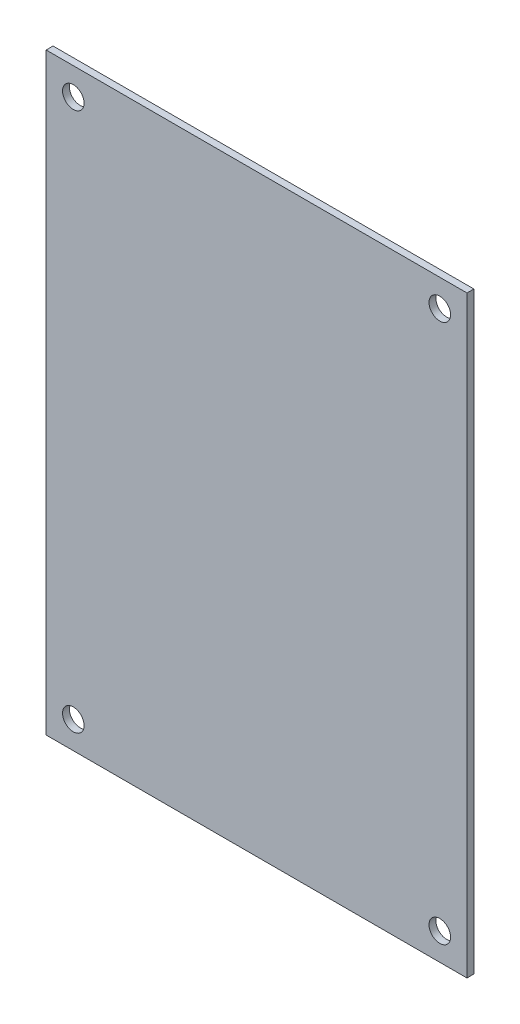
ISO-10303-21;
HEADER;
FILE_DESCRIPTION(('STEP AP214'),'2;1');
FILE_NAME('part.step','',(''),(''),'','','');
FILE_SCHEMA(('AUTOMOTIVE_DESIGN { 1 0 10303 214 1 1 1 1 }'));
ENDSEC;
DATA;
#1=APPLICATION_CONTEXT('core data for automotive mechanical design processes');
#2=APPLICATION_PROTOCOL_DEFINITION('international standard','automotive_design',2000,#1);
#3=PRODUCT_CONTEXT('',#1,'mechanical');
#4=PRODUCT('Part','Part','',(#3));
#5=PRODUCT_RELATED_PRODUCT_CATEGORY('part','',(#4));
#6=PRODUCT_DEFINITION_FORMATION('','',#4);
#7=PRODUCT_DEFINITION_CONTEXT('part definition',#1,'design');
#8=PRODUCT_DEFINITION('design','',#6,#7);
#9=PRODUCT_DEFINITION_SHAPE('','',#8);
#10=(LENGTH_UNIT() NAMED_UNIT(*) SI_UNIT(.MILLI.,.METRE.));
#11=(NAMED_UNIT(*) PLANE_ANGLE_UNIT() SI_UNIT($,.RADIAN.));
#12=(NAMED_UNIT(*) SI_UNIT($,.STERADIAN.) SOLID_ANGLE_UNIT());
#13=UNCERTAINTY_MEASURE_WITH_UNIT(LENGTH_MEASURE(1.E-05),#10,'distance_accuracy_value','');
#14=(GEOMETRIC_REPRESENTATION_CONTEXT(3) GLOBAL_UNCERTAINTY_ASSIGNED_CONTEXT((#13)) GLOBAL_UNIT_ASSIGNED_CONTEXT((#10,
#11,#12)) REPRESENTATION_CONTEXT('',''));
#15=CARTESIAN_POINT('',(0.,0.,0.));
#16=DIRECTION('',(0.,0.,1.));
#17=DIRECTION('',(1.,0.,0.));
#18=AXIS2_PLACEMENT_3D('',#15,#16,#17);
#19=CARTESIAN_POINT('',(61.976,-87.376,-1.016));
#20=DIRECTION('',(1.,0.,0.));
#21=DIRECTION('',(0.,0.,-1.));
#22=AXIS2_PLACEMENT_3D('',#19,#20,#21);
#23=PLANE('',#22);
#24=DIRECTION('',(0.,0.,1.));
#25=VECTOR('',#24,1.);
#26=CARTESIAN_POINT('',(61.976,87.376,-1.016));
#27=LINE('',#26,#25);
#28=CARTESIAN_POINT('',(61.976,87.376,-1.016));
#29=VERTEX_POINT('',#28);
#30=CARTESIAN_POINT('',(61.976,87.376,1.016));
#31=VERTEX_POINT('',#30);
#32=EDGE_CURVE('E44',#29,#31,#27,.T.);
#33=ORIENTED_EDGE('',*,*,#32,.T.);
#34=DIRECTION('',(0.,1.,0.));
#35=VECTOR('',#34,1.);
#36=CARTESIAN_POINT('',(61.976,-87.376,1.016));
#37=LINE('',#36,#35);
#38=CARTESIAN_POINT('',(61.976,-87.376,1.016));
#39=VERTEX_POINT('',#38);
#40=EDGE_CURVE('E82',#39,#31,#37,.T.);
#41=ORIENTED_EDGE('',*,*,#40,.F.);
#42=DIRECTION('',(0.,0.,1.));
#43=VECTOR('',#42,1.);
#44=CARTESIAN_POINT('',(61.976,-87.376,-1.016));
#45=LINE('',#44,#43);
#46=CARTESIAN_POINT('',(61.976,-87.376,-1.016));
#47=VERTEX_POINT('',#46);
#48=EDGE_CURVE('E11',#47,#39,#45,.T.);
#49=ORIENTED_EDGE('',*,*,#48,.F.);
#50=DIRECTION('',(0.,1.,0.));
#51=VECTOR('',#50,1.);
#52=CARTESIAN_POINT('',(61.976,-87.376,-1.016));
#53=LINE('',#52,#51);
#54=EDGE_CURVE('E83',#47,#29,#53,.T.);
#55=ORIENTED_EDGE('',*,*,#54,.T.);
#56=EDGE_LOOP('',(#33,#41,#49,#55));
#57=FACE_BOUND('',#56,.T.);
#58=ADVANCED_FACE('F41',(#57),#23,.T.);
#59=CARTESIAN_POINT('',(-61.976,-87.376,-1.016));
#60=DIRECTION('',(0.,-1.,0.));
#61=DIRECTION('',(0.,0.,-1.));
#62=AXIS2_PLACEMENT_3D('',#59,#60,#61);
#63=PLANE('',#62);
#64=ORIENTED_EDGE('',*,*,#48,.T.);
#65=DIRECTION('',(1.,0.,0.));
#66=VECTOR('',#65,1.);
#67=CARTESIAN_POINT('',(-61.976,-87.376,1.016));
#68=LINE('',#67,#66);
#69=CARTESIAN_POINT('',(-61.976,-87.376,1.016));
#70=VERTEX_POINT('',#69);
#71=EDGE_CURVE('E102',#70,#39,#68,.T.);
#72=ORIENTED_EDGE('',*,*,#71,.F.);
#73=DIRECTION('',(0.,0.,1.));
#74=VECTOR('',#73,1.);
#75=CARTESIAN_POINT('',(-61.976,-87.376,-1.016));
#76=LINE('',#75,#74);
#77=CARTESIAN_POINT('',(-61.976,-87.376,-1.016));
#78=VERTEX_POINT('',#77);
#79=EDGE_CURVE('E50',#78,#70,#76,.T.);
#80=ORIENTED_EDGE('',*,*,#79,.F.);
#81=DIRECTION('',(1.,0.,0.));
#82=VECTOR('',#81,1.);
#83=CARTESIAN_POINT('',(-61.976,-87.376,-1.016));
#84=LINE('',#83,#82);
#85=EDGE_CURVE('E89',#78,#47,#84,.T.);
#86=ORIENTED_EDGE('',*,*,#85,.T.);
#87=EDGE_LOOP('',(#64,#72,#80,#86));
#88=FACE_BOUND('',#87,.T.);
#89=ADVANCED_FACE('F164',(#88),#63,.T.);
#90=CARTESIAN_POINT('',(-61.976,-87.376,-1.016));
#91=DIRECTION('',(-1.,0.,0.));
#92=DIRECTION('',(0.,0.,1.));
#93=AXIS2_PLACEMENT_3D('',#90,#91,#92);
#94=PLANE('',#93);
#95=ORIENTED_EDGE('',*,*,#79,.T.);
#96=DIRECTION('',(0.,-1.,0.));
#97=VECTOR('',#96,1.);
#98=CARTESIAN_POINT('',(-61.976,-87.376,1.016));
#99=LINE('',#98,#97);
#100=CARTESIAN_POINT('',(-61.976,87.376,1.016));
#101=VERTEX_POINT('',#100);
#102=EDGE_CURVE('E97',#101,#70,#99,.T.);
#103=ORIENTED_EDGE('',*,*,#102,.F.);
#104=DIRECTION('',(0.,0.,1.));
#105=VECTOR('',#104,1.);
#106=CARTESIAN_POINT('',(-61.976,87.376,-1.016));
#107=LINE('',#106,#105);
#108=CARTESIAN_POINT('',(-61.976,87.376,-1.016));
#109=VERTEX_POINT('',#108);
#110=EDGE_CURVE('E88',#109,#101,#107,.T.);
#111=ORIENTED_EDGE('',*,*,#110,.F.);
#112=DIRECTION('',(0.,-1.,0.));
#113=VECTOR('',#112,1.);
#114=CARTESIAN_POINT('',(-61.976,-87.376,-1.016));
#115=LINE('',#114,#113);
#116=EDGE_CURVE('E138',#109,#78,#115,.T.);
#117=ORIENTED_EDGE('',*,*,#116,.T.);
#118=EDGE_LOOP('',(#95,#103,#111,#117));
#119=FACE_BOUND('',#118,.T.);
#120=ADVANCED_FACE('F161',(#119),#94,.T.);
#121=CARTESIAN_POINT('',(-61.976,87.376,-1.016));
#122=DIRECTION('',(0.,1.,0.));
#123=DIRECTION('',(0.,0.,1.));
#124=AXIS2_PLACEMENT_3D('',#121,#122,#123);
#125=PLANE('',#124);
#126=ORIENTED_EDGE('',*,*,#110,.T.);
#127=DIRECTION('',(-1.,0.,0.));
#128=VECTOR('',#127,1.);
#129=CARTESIAN_POINT('',(-61.976,87.376,1.016));
#130=LINE('',#129,#128);
#131=EDGE_CURVE('E91',#31,#101,#130,.T.);
#132=ORIENTED_EDGE('',*,*,#131,.F.);
#133=ORIENTED_EDGE('',*,*,#32,.F.);
#134=DIRECTION('',(-1.,0.,0.));
#135=VECTOR('',#134,1.);
#136=CARTESIAN_POINT('',(-61.976,87.376,-1.016));
#137=LINE('',#136,#135);
#138=EDGE_CURVE('E135',#29,#109,#137,.T.);
#139=ORIENTED_EDGE('',*,*,#138,.T.);
#140=EDGE_LOOP('',(#126,#132,#133,#139));
#141=FACE_BOUND('',#140,.T.);
#142=ADVANCED_FACE('F92',(#141),#125,.T.);
#143=CARTESIAN_POINT('',(0.,0.,-1.016));
#144=DIRECTION('',(0.,0.,-1.));
#145=DIRECTION('',(-1.,0.,0.));
#146=AXIS2_PLACEMENT_3D('',#143,#144,#145);
#147=PLANE('',#146);
#148=CARTESIAN_POINT('',(-53.975,-79.375,-1.016));
#149=DIRECTION('',(0.,0.,1.));
#150=DIRECTION('',(1.,0.,0.));
#151=AXIS2_PLACEMENT_3D('',#148,#149,#150);
#152=CIRCLE('',#151,3.175);
#153=CARTESIAN_POINT('',(-50.8,-79.375,-1.016));
#154=VERTEX_POINT('',#153);
#155=EDGE_CURVE('E117',#154,#154,#152,.T.);
#156=ORIENTED_EDGE('',*,*,#155,.T.);
#157=EDGE_LOOP('',(#156));
#158=FACE_BOUND('',#157,.T.);
#159=CARTESIAN_POINT('',(53.975,-79.375,-1.016));
#160=DIRECTION('',(0.,0.,1.));
#161=DIRECTION('',(1.,0.,0.));
#162=AXIS2_PLACEMENT_3D('',#159,#160,#161);
#163=CIRCLE('',#162,3.175);
#164=CARTESIAN_POINT('',(57.15,-79.375,-1.016));
#165=VERTEX_POINT('',#164);
#166=EDGE_CURVE('E121',#165,#165,#163,.T.);
#167=ORIENTED_EDGE('',*,*,#166,.T.);
#168=EDGE_LOOP('',(#167));
#169=FACE_BOUND('',#168,.T.);
#170=CARTESIAN_POINT('',(53.975,79.375,-1.016));
#171=DIRECTION('',(0.,0.,1.));
#172=DIRECTION('',(1.,0.,0.));
#173=AXIS2_PLACEMENT_3D('',#170,#171,#172);
#174=CIRCLE('',#173,3.175);
#175=CARTESIAN_POINT('',(57.15,79.375,-1.016));
#176=VERTEX_POINT('',#175);
#177=EDGE_CURVE('E125',#176,#176,#174,.T.);
#178=ORIENTED_EDGE('',*,*,#177,.T.);
#179=EDGE_LOOP('',(#178));
#180=FACE_BOUND('',#179,.T.);
#181=CARTESIAN_POINT('',(-53.975,79.375,-1.016));
#182=DIRECTION('',(0.,0.,1.));
#183=DIRECTION('',(1.,0.,0.));
#184=AXIS2_PLACEMENT_3D('',#181,#182,#183);
#185=CIRCLE('',#184,3.175);
#186=CARTESIAN_POINT('',(-50.8,79.375,-1.016));
#187=VERTEX_POINT('',#186);
#188=EDGE_CURVE('E129',#187,#187,#185,.T.);
#189=ORIENTED_EDGE('',*,*,#188,.T.);
#190=EDGE_LOOP('',(#189));
#191=FACE_BOUND('',#190,.T.);
#192=ORIENTED_EDGE('',*,*,#54,.F.);
#193=ORIENTED_EDGE('',*,*,#85,.F.);
#194=ORIENTED_EDGE('',*,*,#116,.F.);
#195=ORIENTED_EDGE('',*,*,#138,.F.);
#196=EDGE_LOOP('',(#192,#193,#194,#195));
#197=FACE_BOUND('',#196,.T.);
#198=ADVANCED_FACE('F166',(#158,#169,#180,#191,#197),#147,.T.);
#199=CARTESIAN_POINT('',(-53.975,79.375,-1.016));
#200=DIRECTION('',(0.,0.,1.));
#201=DIRECTION('',(1.,0.,0.));
#202=AXIS2_PLACEMENT_3D('',#199,#200,#201);
#203=CYLINDRICAL_SURFACE('',#202,3.175);
#204=ORIENTED_EDGE('',*,*,#188,.F.);
#205=EDGE_LOOP('',(#204));
#206=FACE_BOUND('',#205,.T.);
#207=CARTESIAN_POINT('',(-53.975,79.375,1.016));
#208=DIRECTION('',(0.,0.,1.));
#209=DIRECTION('',(1.,0.,0.));
#210=AXIS2_PLACEMENT_3D('',#207,#208,#209);
#211=CIRCLE('',#210,3.175);
#212=CARTESIAN_POINT('',(-50.8,79.375,1.016));
#213=VERTEX_POINT('',#212);
#214=EDGE_CURVE('E104',#213,#213,#211,.T.);
#215=ORIENTED_EDGE('',*,*,#214,.T.);
#216=EDGE_LOOP('',(#215));
#217=FACE_BOUND('',#216,.T.);
#218=ADVANCED_FACE('F168',(#206,#217),#203,.F.);
#219=CARTESIAN_POINT('',(53.975,79.375,-1.016));
#220=DIRECTION('',(0.,0.,1.));
#221=DIRECTION('',(1.,0.,0.));
#222=AXIS2_PLACEMENT_3D('',#219,#220,#221);
#223=CYLINDRICAL_SURFACE('',#222,3.175);
#224=ORIENTED_EDGE('',*,*,#177,.F.);
#225=EDGE_LOOP('',(#224));
#226=FACE_BOUND('',#225,.T.);
#227=CARTESIAN_POINT('',(53.975,79.375,1.016));
#228=DIRECTION('',(0.,0.,1.));
#229=DIRECTION('',(1.,0.,0.));
#230=AXIS2_PLACEMENT_3D('',#227,#228,#229);
#231=CIRCLE('',#230,3.175);
#232=CARTESIAN_POINT('',(57.15,79.375,1.016));
#233=VERTEX_POINT('',#232);
#234=EDGE_CURVE('E109',#233,#233,#231,.T.);
#235=ORIENTED_EDGE('',*,*,#234,.T.);
#236=EDGE_LOOP('',(#235));
#237=FACE_BOUND('',#236,.T.);
#238=ADVANCED_FACE('F175',(#226,#237),#223,.F.);
#239=CARTESIAN_POINT('',(53.975,-79.375,-1.016));
#240=DIRECTION('',(0.,0.,1.));
#241=DIRECTION('',(1.,0.,0.));
#242=AXIS2_PLACEMENT_3D('',#239,#240,#241);
#243=CYLINDRICAL_SURFACE('',#242,3.175);
#244=ORIENTED_EDGE('',*,*,#166,.F.);
#245=EDGE_LOOP('',(#244));
#246=FACE_BOUND('',#245,.T.);
#247=CARTESIAN_POINT('',(53.975,-79.375,1.016));
#248=DIRECTION('',(0.,0.,1.));
#249=DIRECTION('',(1.,0.,0.));
#250=AXIS2_PLACEMENT_3D('',#247,#248,#249);
#251=CIRCLE('',#250,3.175);
#252=CARTESIAN_POINT('',(57.15,-79.375,1.016));
#253=VERTEX_POINT('',#252);
#254=EDGE_CURVE('E252',#253,#253,#251,.T.);
#255=ORIENTED_EDGE('',*,*,#254,.T.);
#256=EDGE_LOOP('',(#255));
#257=FACE_BOUND('',#256,.T.);
#258=ADVANCED_FACE('F213',(#246,#257),#243,.F.);
#259=CARTESIAN_POINT('',(-53.975,-79.375,-1.016));
#260=DIRECTION('',(0.,0.,1.));
#261=DIRECTION('',(1.,0.,0.));
#262=AXIS2_PLACEMENT_3D('',#259,#260,#261);
#263=CYLINDRICAL_SURFACE('',#262,3.175);
#264=ORIENTED_EDGE('',*,*,#155,.F.);
#265=EDGE_LOOP('',(#264));
#266=FACE_BOUND('',#265,.T.);
#267=CARTESIAN_POINT('',(-53.975,-79.375,1.016));
#268=DIRECTION('',(0.,0.,1.));
#269=DIRECTION('',(1.,0.,0.));
#270=AXIS2_PLACEMENT_3D('',#267,#268,#269);
#271=CIRCLE('',#270,3.175);
#272=CARTESIAN_POINT('',(-50.8,-79.375,1.016));
#273=VERTEX_POINT('',#272);
#274=EDGE_CURVE('E249',#273,#273,#271,.T.);
#275=ORIENTED_EDGE('',*,*,#274,.T.);
#276=EDGE_LOOP('',(#275));
#277=FACE_BOUND('',#276,.T.);
#278=ADVANCED_FACE('F223',(#266,#277),#263,.F.);
#279=CARTESIAN_POINT('',(0.,0.,1.016));
#280=DIRECTION('',(0.,0.,-1.));
#281=DIRECTION('',(-1.,0.,0.));
#282=AXIS2_PLACEMENT_3D('',#279,#280,#281);
#283=PLANE('',#282);
#284=ORIENTED_EDGE('',*,*,#40,.T.);
#285=ORIENTED_EDGE('',*,*,#131,.T.);
#286=ORIENTED_EDGE('',*,*,#102,.T.);
#287=ORIENTED_EDGE('',*,*,#71,.T.);
#288=EDGE_LOOP('',(#284,#285,#286,#287));
#289=FACE_BOUND('',#288,.T.);
#290=ORIENTED_EDGE('',*,*,#214,.F.);
#291=EDGE_LOOP('',(#290));
#292=FACE_BOUND('',#291,.T.);
#293=ORIENTED_EDGE('',*,*,#234,.F.);
#294=EDGE_LOOP('',(#293));
#295=FACE_BOUND('',#294,.T.);
#296=ORIENTED_EDGE('',*,*,#254,.F.);
#297=EDGE_LOOP('',(#296));
#298=FACE_BOUND('',#297,.T.);
#299=ORIENTED_EDGE('',*,*,#274,.F.);
#300=EDGE_LOOP('',(#299));
#301=FACE_BOUND('',#300,.T.);
#302=ADVANCED_FACE('F100',(#289,#292,#295,#298,#301),#283,.F.);
#303=CLOSED_SHELL('',(#58,#89,#120,#142,#198,#218,#238,#258,#278,#302));
#304=MANIFOLD_SOLID_BREP('B2',#303);
#305=ADVANCED_BREP_SHAPE_REPRESENTATION('',(#18,#304),#14);
#306=SHAPE_DEFINITION_REPRESENTATION(#9,#305);
ENDSEC;
END-ISO-10303-21;
